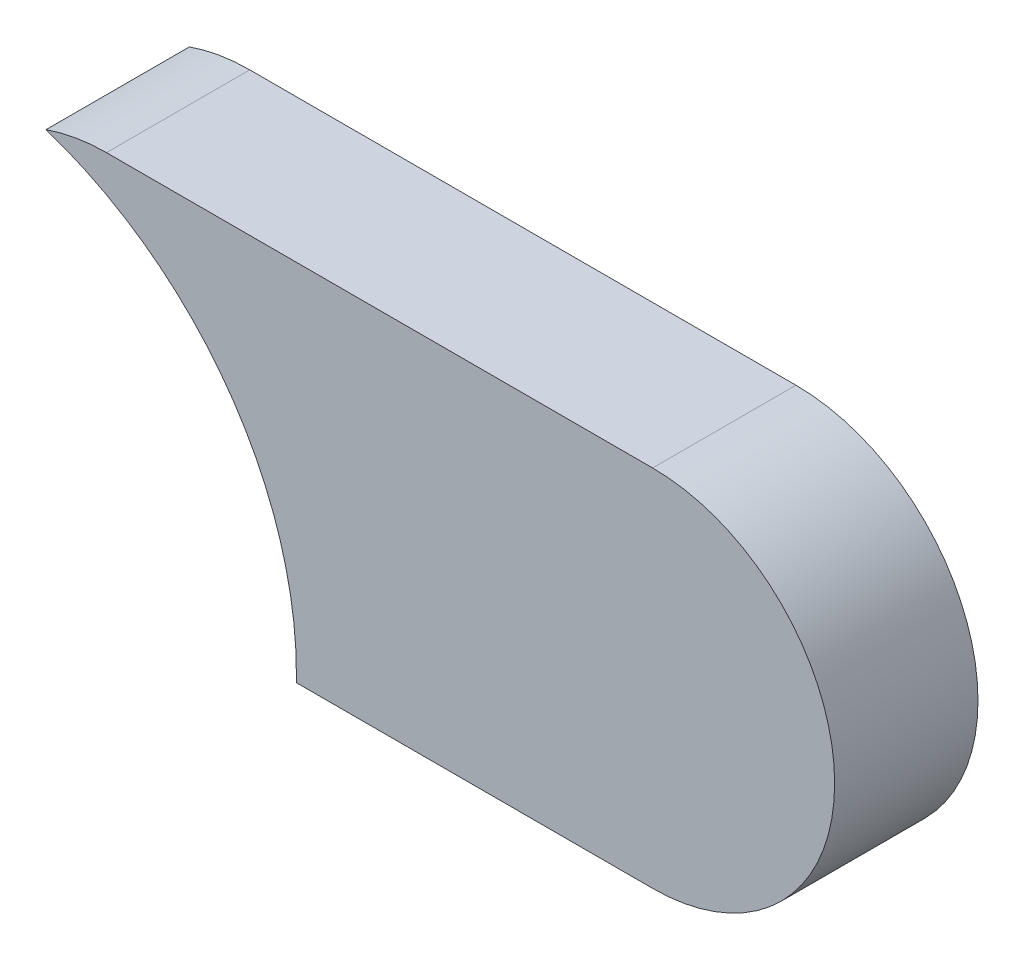
ISO-10303-21;
HEADER;
FILE_DESCRIPTION(('STEP AP214'),'2;1');
FILE_NAME('part.step','',(''),(''),'','','');
FILE_SCHEMA(('AUTOMOTIVE_DESIGN { 1 0 10303 214 1 1 1 1 }'));
ENDSEC;
DATA;
#1=APPLICATION_CONTEXT('core data for automotive mechanical design processes');
#2=APPLICATION_PROTOCOL_DEFINITION('international standard','automotive_design',2000,#1);
#3=PRODUCT_CONTEXT('',#1,'mechanical');
#4=PRODUCT('Part','Part','',(#3));
#5=PRODUCT_RELATED_PRODUCT_CATEGORY('part','',(#4));
#6=PRODUCT_DEFINITION_FORMATION('','',#4);
#7=PRODUCT_DEFINITION_CONTEXT('part definition',#1,'design');
#8=PRODUCT_DEFINITION('design','',#6,#7);
#9=PRODUCT_DEFINITION_SHAPE('','',#8);
#10=(LENGTH_UNIT() NAMED_UNIT(*) SI_UNIT(.MILLI.,.METRE.));
#11=(NAMED_UNIT(*) PLANE_ANGLE_UNIT() SI_UNIT($,.RADIAN.));
#12=(NAMED_UNIT(*) SI_UNIT($,.STERADIAN.) SOLID_ANGLE_UNIT());
#13=UNCERTAINTY_MEASURE_WITH_UNIT(LENGTH_MEASURE(1.E-05),#10,'distance_accuracy_value','');
#14=(GEOMETRIC_REPRESENTATION_CONTEXT(3) GLOBAL_UNCERTAINTY_ASSIGNED_CONTEXT((#13)) GLOBAL_UNIT_ASSIGNED_CONTEXT((#10,
#11,#12)) REPRESENTATION_CONTEXT('',''));
#15=CARTESIAN_POINT('',(0.,0.,0.));
#16=DIRECTION('',(0.,0.,1.));
#17=DIRECTION('',(1.,0.,0.));
#18=AXIS2_PLACEMENT_3D('',#15,#16,#17);
#19=CARTESIAN_POINT('',(153.288880930531,101.7160018,0.));
#20=DIRECTION('',(0.,1.,0.));
#21=DIRECTION('',(1.,0.,0.));
#22=AXIS2_PLACEMENT_3D('',#19,#20,#21);
#23=PLANE('',#22);
#24=DIRECTION('',(1.,0.,0.));
#25=VECTOR('',#24,1.);
#26=CARTESIAN_POINT('',(153.0240018,101.7160018,0.1999996));
#27=LINE('',#26,#25);
#28=CARTESIAN_POINT('',(153.288880930531,101.7160018,0.1999996));
#29=VERTEX_POINT('',#28);
#30=CARTESIAN_POINT('',(153.7860018,101.7160018,0.1999996));
#31=VERTEX_POINT('',#30);
#32=EDGE_CURVE('E11',#29,#31,#27,.T.);
#33=ORIENTED_EDGE('',*,*,#32,.F.);
#34=DIRECTION('',(0.,0.,1.));
#35=VECTOR('',#34,1.);
#36=CARTESIAN_POINT('',(153.288880930531,101.7160018,0.));
#37=LINE('',#36,#35);
#38=CARTESIAN_POINT('',(153.288880930531,101.7160018,0.));
#39=VERTEX_POINT('',#38);
#40=EDGE_CURVE('E24',#39,#29,#37,.T.);
#41=ORIENTED_EDGE('',*,*,#40,.F.);
#42=DIRECTION('',(1.,0.,0.));
#43=VECTOR('',#42,1.);
#44=CARTESIAN_POINT('',(153.0240018,101.7160018,0.));
#45=LINE('',#44,#43);
#46=CARTESIAN_POINT('',(153.7860018,101.7160018,0.));
#47=VERTEX_POINT('',#46);
#48=EDGE_CURVE('E88',#39,#47,#45,.T.);
#49=ORIENTED_EDGE('',*,*,#48,.T.);
#50=DIRECTION('',(0.,0.,1.));
#51=VECTOR('',#50,1.);
#52=CARTESIAN_POINT('',(153.7860018,101.7160018,0.));
#53=LINE('',#52,#51);
#54=EDGE_CURVE('E37',#47,#31,#53,.T.);
#55=ORIENTED_EDGE('',*,*,#54,.T.);
#56=EDGE_LOOP('',(#33,#41,#49,#55));
#57=FACE_BOUND('',#56,.T.);
#58=ADVANCED_FACE('F17',(#57),#23,.F.);
#59=CARTESIAN_POINT('',(153.7860018,101.9700018,0.));
#60=DIRECTION('',(0.,0.,-1.));
#61=DIRECTION('',(-1.11896493820486E-13,-1.,0.));
#62=AXIS2_PLACEMENT_3D('',#59,#60,#61);
#63=CYLINDRICAL_SURFACE('',#62,0.254);
#64=CARTESIAN_POINT('',(153.7860018,101.9700018,0.1999996));
#65=DIRECTION('',(0.,0.,1.));
#66=DIRECTION('',(-1.11896493820486E-13,-1.,0.));
#67=AXIS2_PLACEMENT_3D('',#64,#65,#66);
#68=CIRCLE('',#67,0.254);
#69=CARTESIAN_POINT('',(153.7860018,102.2240018,0.1999996));
#70=VERTEX_POINT('',#69);
#71=EDGE_CURVE('E111',#31,#70,#68,.T.);
#72=ORIENTED_EDGE('',*,*,#71,.F.);
#73=ORIENTED_EDGE('',*,*,#54,.F.);
#74=CARTESIAN_POINT('',(153.7860018,101.9700018,0.));
#75=DIRECTION('',(0.,0.,1.));
#76=DIRECTION('',(-1.11896493820486E-13,-1.,0.));
#77=AXIS2_PLACEMENT_3D('',#74,#75,#76);
#78=CIRCLE('',#77,0.254);
#79=CARTESIAN_POINT('',(153.7860018,102.2240018,0.));
#80=VERTEX_POINT('',#79);
#81=EDGE_CURVE('E108',#47,#80,#78,.T.);
#82=ORIENTED_EDGE('',*,*,#81,.T.);
#83=DIRECTION('',(0.,0.,1.));
#84=VECTOR('',#83,1.);
#85=CARTESIAN_POINT('',(153.7860018,102.2240018,0.));
#86=LINE('',#85,#84);
#87=EDGE_CURVE('E106',#80,#70,#86,.T.);
#88=ORIENTED_EDGE('',*,*,#87,.T.);
#89=EDGE_LOOP('',(#72,#73,#82,#88));
#90=FACE_BOUND('',#89,.T.);
#91=ADVANCED_FACE('F118',(#90),#63,.T.);
#92=CARTESIAN_POINT('',(153.7860018,102.2240018,0.));
#93=DIRECTION('',(0.,-1.,0.));
#94=DIRECTION('',(-1.,0.,0.));
#95=AXIS2_PLACEMENT_3D('',#92,#93,#94);
#96=PLANE('',#95);
#97=DIRECTION('',(-1.,0.,0.));
#98=VECTOR('',#97,1.);
#99=CARTESIAN_POINT('',(153.7860018,102.2240018,0.1999996));
#100=LINE('',#99,#98);
#101=CARTESIAN_POINT('',(153.0240018,102.2240018,0.1999996));
#102=VERTEX_POINT('',#101);
#103=EDGE_CURVE('E103',#70,#102,#100,.T.);
#104=ORIENTED_EDGE('',*,*,#103,.F.);
#105=ORIENTED_EDGE('',*,*,#87,.F.);
#106=DIRECTION('',(-1.,0.,0.));
#107=VECTOR('',#106,1.);
#108=CARTESIAN_POINT('',(153.7860018,102.2240018,0.));
#109=LINE('',#108,#107);
#110=CARTESIAN_POINT('',(153.0240018,102.2240018,0.));
#111=VERTEX_POINT('',#110);
#112=EDGE_CURVE('E100',#80,#111,#109,.T.);
#113=ORIENTED_EDGE('',*,*,#112,.T.);
#114=DIRECTION('',(0.,0.,1.));
#115=VECTOR('',#114,1.);
#116=CARTESIAN_POINT('',(153.0240018,102.2240018,0.));
#117=LINE('',#116,#115);
#118=EDGE_CURVE('E98',#111,#102,#117,.T.);
#119=ORIENTED_EDGE('',*,*,#118,.T.);
#120=EDGE_LOOP('',(#104,#105,#113,#119));
#121=FACE_BOUND('',#120,.T.);
#122=ADVANCED_FACE('F124',(#121),#96,.F.);
#123=CARTESIAN_POINT('',(153.0240018,101.9700018,0.));
#124=DIRECTION('',(0.,0.,-1.));
#125=DIRECTION('',(-1.11896493820486E-13,1.,0.));
#126=AXIS2_PLACEMENT_3D('',#123,#124,#125);
#127=CYLINDRICAL_SURFACE('',#126,0.25400000000001);
#128=CARTESIAN_POINT('',(153.0240018,101.9700018,0.1999996));
#129=DIRECTION('',(0.,0.,1.));
#130=DIRECTION('',(-1.11896493820486E-13,1.,0.));
#131=AXIS2_PLACEMENT_3D('',#128,#129,#130);
#132=CIRCLE('',#131,0.25400000000001);
#133=CARTESIAN_POINT('',(152.939656935829,102.209588827796,0.1999996));
#134=VERTEX_POINT('',#133);
#135=EDGE_CURVE('E95',#102,#134,#132,.T.);
#136=ORIENTED_EDGE('',*,*,#135,.F.);
#137=ORIENTED_EDGE('',*,*,#118,.F.);
#138=CARTESIAN_POINT('',(153.0240018,101.9700018,0.));
#139=DIRECTION('',(0.,0.,1.));
#140=DIRECTION('',(-1.11896493820486E-13,1.,0.));
#141=AXIS2_PLACEMENT_3D('',#138,#139,#140);
#142=CIRCLE('',#141,0.25400000000001);
#143=CARTESIAN_POINT('',(152.939656935829,102.209588827796,0.));
#144=VERTEX_POINT('',#143);
#145=EDGE_CURVE('E93',#111,#144,#142,.T.);
#146=ORIENTED_EDGE('',*,*,#145,.T.);
#147=DIRECTION('',(0.,0.,1.));
#148=VECTOR('',#147,1.);
#149=CARTESIAN_POINT('',(152.939656935829,102.209588827796,0.));
#150=LINE('',#149,#148);
#151=EDGE_CURVE('E75',#144,#134,#150,.T.);
#152=ORIENTED_EDGE('',*,*,#151,.T.);
#153=EDGE_LOOP('',(#136,#137,#146,#152));
#154=FACE_BOUND('',#153,.T.);
#155=ADVANCED_FACE('F126',(#154),#127,.T.);
#156=CARTESIAN_POINT('',(152.781,101.727,0.));
#157=DIRECTION('',(0.,0.,-1.));
#158=DIRECTION('',(1.,0.,0.));
#159=AXIS2_PLACEMENT_3D('',#156,#157,#158);
#160=CYLINDRICAL_SURFACE('',#159,0.508);
#161=DIRECTION('',(0.,0.,1.));
#162=VECTOR('',#161,1.);
#163=CARTESIAN_POINT('',(153.289,101.727,0.));
#164=LINE('',#163,#162);
#165=CARTESIAN_POINT('',(153.289,101.727,0.));
#166=VERTEX_POINT('',#165);
#167=CARTESIAN_POINT('',(153.289,101.727,0.1999996));
#168=VERTEX_POINT('',#167);
#169=EDGE_CURVE('E65',#166,#168,#164,.T.);
#170=ORIENTED_EDGE('',*,*,#169,.T.);
#171=CARTESIAN_POINT('',(152.781,101.727,0.1999996));
#172=DIRECTION('',(0.,0.,1.));
#173=DIRECTION('',(1.,0.,0.));
#174=AXIS2_PLACEMENT_3D('',#171,#172,#173);
#175=CIRCLE('',#174,0.508);
#176=EDGE_CURVE('E76',#168,#134,#175,.T.);
#177=ORIENTED_EDGE('',*,*,#176,.T.);
#178=ORIENTED_EDGE('',*,*,#151,.F.);
#179=CARTESIAN_POINT('',(152.781,101.727,0.));
#180=DIRECTION('',(0.,0.,1.));
#181=DIRECTION('',(1.,0.,0.));
#182=AXIS2_PLACEMENT_3D('',#179,#180,#181);
#183=CIRCLE('',#182,0.508);
#184=EDGE_CURVE('E79',#166,#144,#183,.T.);
#185=ORIENTED_EDGE('',*,*,#184,.F.);
#186=EDGE_LOOP('',(#170,#177,#178,#185));
#187=FACE_BOUND('',#186,.T.);
#188=ADVANCED_FACE('F80',(#187),#160,.F.);
#189=CARTESIAN_POINT('',(152.781,101.727,0.));
#190=DIRECTION('',(0.,0.,-1.));
#191=DIRECTION('',(1.,0.,0.));
#192=AXIS2_PLACEMENT_3D('',#189,#190,#191);
#193=CYLINDRICAL_SURFACE('',#192,0.508);
#194=ORIENTED_EDGE('',*,*,#40,.T.);
#195=CARTESIAN_POINT('',(152.781,101.727,0.1999996));
#196=DIRECTION('',(0.,0.,1.));
#197=DIRECTION('',(1.,0.,0.));
#198=AXIS2_PLACEMENT_3D('',#195,#196,#197);
#199=CIRCLE('',#198,0.508);
#200=EDGE_CURVE('E71',#29,#168,#199,.T.);
#201=ORIENTED_EDGE('',*,*,#200,.T.);
#202=ORIENTED_EDGE('',*,*,#169,.F.);
#203=EDGE_CURVE('E69',#39,#166,#183,.T.);
#204=ORIENTED_EDGE('',*,*,#203,.F.);
#205=EDGE_LOOP('',(#194,#201,#202,#204));
#206=FACE_BOUND('',#205,.T.);
#207=ADVANCED_FACE('F67',(#206),#193,.F.);
#208=CARTESIAN_POINT('',(153.0240018,101.7160018,0.));
#209=DIRECTION('',(0.,0.,-1.));
#210=DIRECTION('',(-1.,0.,0.));
#211=AXIS2_PLACEMENT_3D('',#208,#209,#210);
#212=PLANE('',#211);
#213=ORIENTED_EDGE('',*,*,#48,.F.);
#214=ORIENTED_EDGE('',*,*,#203,.T.);
#215=ORIENTED_EDGE('',*,*,#184,.T.);
#216=ORIENTED_EDGE('',*,*,#145,.F.);
#217=ORIENTED_EDGE('',*,*,#112,.F.);
#218=ORIENTED_EDGE('',*,*,#81,.F.);
#219=EDGE_LOOP('',(#213,#214,#215,#216,#217,#218));
#220=FACE_BOUND('',#219,.T.);
#221=ADVANCED_FACE('F86',(#220),#212,.T.);
#222=CARTESIAN_POINT('',(153.0240018,101.7160018,0.1999996));
#223=DIRECTION('',(0.,0.,-1.));
#224=DIRECTION('',(-1.,0.,0.));
#225=AXIS2_PLACEMENT_3D('',#222,#223,#224);
#226=PLANE('',#225);
#227=ORIENTED_EDGE('',*,*,#200,.F.);
#228=ORIENTED_EDGE('',*,*,#32,.T.);
#229=ORIENTED_EDGE('',*,*,#71,.T.);
#230=ORIENTED_EDGE('',*,*,#103,.T.);
#231=ORIENTED_EDGE('',*,*,#135,.T.);
#232=ORIENTED_EDGE('',*,*,#176,.F.);
#233=EDGE_LOOP('',(#227,#228,#229,#230,#231,#232));
#234=FACE_BOUND('',#233,.T.);
#235=ADVANCED_FACE('F121',(#234),#226,.F.);
#236=CLOSED_SHELL('',(#58,#91,#122,#155,#188,#207,#221,#235));
#237=MANIFOLD_SOLID_BREP('B1',#236);
#238=ADVANCED_BREP_SHAPE_REPRESENTATION('',(#18,#237),#14);
#239=SHAPE_DEFINITION_REPRESENTATION(#9,#238);
ENDSEC;
END-ISO-10303-21;
